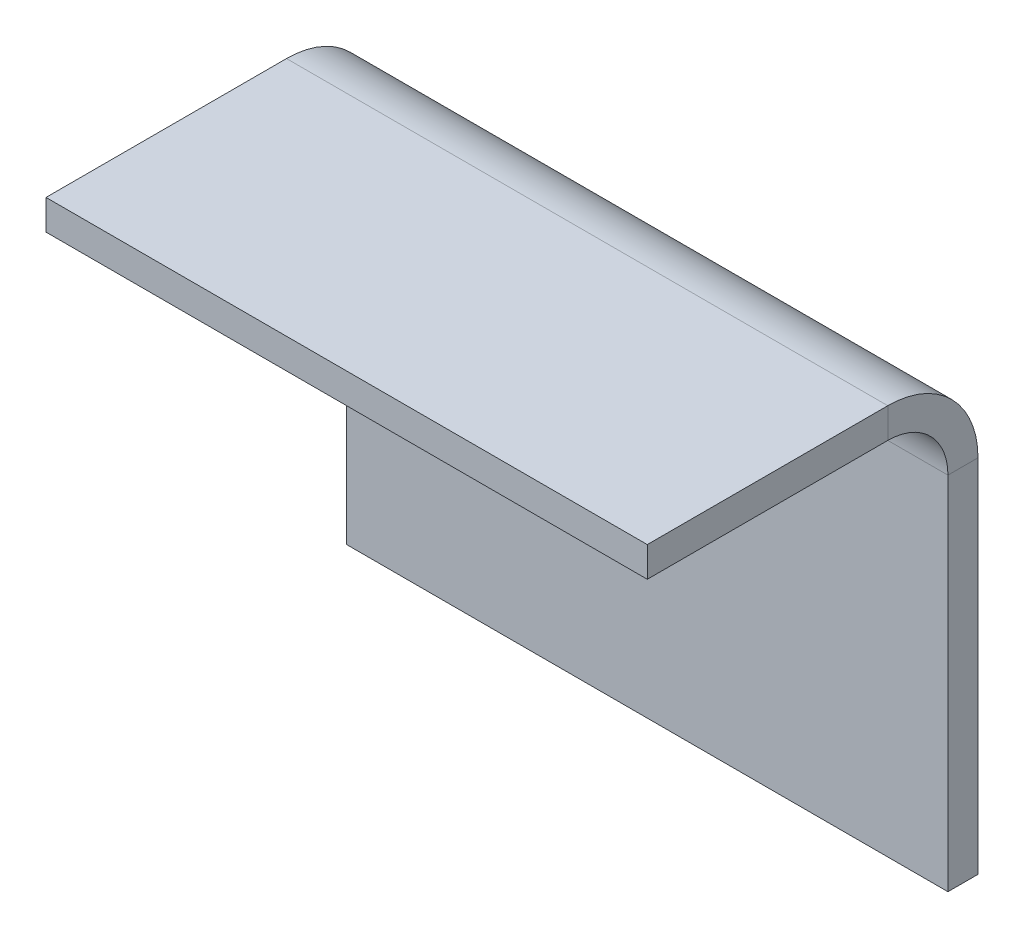
ISO-10303-21;
HEADER;
FILE_DESCRIPTION(('STEP AP214'),'2;1');
FILE_NAME('part.step','',(''),(''),'','','');
FILE_SCHEMA(('AUTOMOTIVE_DESIGN { 1 0 10303 214 1 1 1 1 }'));
ENDSEC;
DATA;
#1=APPLICATION_CONTEXT('core data for automotive mechanical design processes');
#2=APPLICATION_PROTOCOL_DEFINITION('international standard','automotive_design',2000,#1);
#3=PRODUCT_CONTEXT('',#1,'mechanical');
#4=PRODUCT('Part','Part','',(#3));
#5=PRODUCT_RELATED_PRODUCT_CATEGORY('part','',(#4));
#6=PRODUCT_DEFINITION_FORMATION('','',#4);
#7=PRODUCT_DEFINITION_CONTEXT('part definition',#1,'design');
#8=PRODUCT_DEFINITION('design','',#6,#7);
#9=PRODUCT_DEFINITION_SHAPE('','',#8);
#10=(LENGTH_UNIT() NAMED_UNIT(*) SI_UNIT(.MILLI.,.METRE.));
#11=(NAMED_UNIT(*) PLANE_ANGLE_UNIT() SI_UNIT($,.RADIAN.));
#12=(NAMED_UNIT(*) SI_UNIT($,.STERADIAN.) SOLID_ANGLE_UNIT());
#13=UNCERTAINTY_MEASURE_WITH_UNIT(LENGTH_MEASURE(1.E-05),#10,'distance_accuracy_value','');
#14=(GEOMETRIC_REPRESENTATION_CONTEXT(3) GLOBAL_UNCERTAINTY_ASSIGNED_CONTEXT((#13)) GLOBAL_UNIT_ASSIGNED_CONTEXT((#10,
#11,#12)) REPRESENTATION_CONTEXT('',''));
#15=CARTESIAN_POINT('',(0.,0.,0.));
#16=DIRECTION('',(0.,0.,1.));
#17=DIRECTION('',(1.,0.,0.));
#18=AXIS2_PLACEMENT_3D('',#15,#16,#17);
#19=CARTESIAN_POINT('',(0.,0.,-1.));
#20=DIRECTION('',(-1.,0.,0.));
#21=DIRECTION('',(0.,0.,1.));
#22=AXIS2_PLACEMENT_3D('',#19,#20,#21);
#23=PLANE('',#22);
#24=DIRECTION('',(0.,-1.,0.));
#25=VECTOR('',#24,1.);
#26=CARTESIAN_POINT('',(0.,0.,0.));
#27=LINE('',#26,#25);
#28=CARTESIAN_POINT('',(0.,12.,0.));
#29=VERTEX_POINT('',#28);
#30=CARTESIAN_POINT('',(0.,0.,0.));
#31=VERTEX_POINT('',#30);
#32=EDGE_CURVE('E192',#29,#31,#27,.T.);
#33=ORIENTED_EDGE('',*,*,#32,.F.);
#34=DIRECTION('',(0.,0.,-1.));
#35=VECTOR('',#34,1.);
#36=CARTESIAN_POINT('',(0.,12.,0.));
#37=LINE('',#36,#35);
#38=CARTESIAN_POINT('',(0.,12.,-1.));
#39=VERTEX_POINT('',#38);
#40=EDGE_CURVE('E180',#29,#39,#37,.T.);
#41=ORIENTED_EDGE('',*,*,#40,.T.);
#42=DIRECTION('',(0.,-1.,0.));
#43=VECTOR('',#42,1.);
#44=CARTESIAN_POINT('',(0.,0.,-1.));
#45=LINE('',#44,#43);
#46=CARTESIAN_POINT('',(0.,0.,-1.));
#47=VERTEX_POINT('',#46);
#48=EDGE_CURVE('E191',#39,#47,#45,.T.);
#49=ORIENTED_EDGE('',*,*,#48,.T.);
#50=DIRECTION('',(0.,0.,1.));
#51=VECTOR('',#50,1.);
#52=CARTESIAN_POINT('',(0.,0.,-1.));
#53=LINE('',#52,#51);
#54=EDGE_CURVE('E70',#47,#31,#53,.T.);
#55=ORIENTED_EDGE('',*,*,#54,.T.);
#56=EDGE_LOOP('',(#33,#41,#49,#55));
#57=FACE_BOUND('',#56,.T.);
#58=ADVANCED_FACE('F61',(#57),#23,.T.);
#59=CARTESIAN_POINT('',(20.,0.,-1.));
#60=DIRECTION('',(1.,0.,0.));
#61=DIRECTION('',(0.,0.,-1.));
#62=AXIS2_PLACEMENT_3D('',#59,#60,#61);
#63=PLANE('',#62);
#64=DIRECTION('',(0.,1.,0.));
#65=VECTOR('',#64,1.);
#66=CARTESIAN_POINT('',(20.,0.,0.));
#67=LINE('',#66,#65);
#68=CARTESIAN_POINT('',(20.,0.,0.));
#69=VERTEX_POINT('',#68);
#70=CARTESIAN_POINT('',(20.,12.,0.));
#71=VERTEX_POINT('',#70);
#72=EDGE_CURVE('E197',#69,#71,#67,.T.);
#73=ORIENTED_EDGE('',*,*,#72,.F.);
#74=DIRECTION('',(0.,0.,1.));
#75=VECTOR('',#74,1.);
#76=CARTESIAN_POINT('',(20.,0.,-1.));
#77=LINE('',#76,#75);
#78=CARTESIAN_POINT('',(20.,0.,-1.));
#79=VERTEX_POINT('',#78);
#80=EDGE_CURVE('E13',#79,#69,#77,.T.);
#81=ORIENTED_EDGE('',*,*,#80,.F.);
#82=DIRECTION('',(0.,1.,0.));
#83=VECTOR('',#82,1.);
#84=CARTESIAN_POINT('',(20.,0.,-1.));
#85=LINE('',#84,#83);
#86=CARTESIAN_POINT('',(20.,12.,-1.));
#87=VERTEX_POINT('',#86);
#88=EDGE_CURVE('E199',#79,#87,#85,.T.);
#89=ORIENTED_EDGE('',*,*,#88,.T.);
#90=DIRECTION('',(0.,0.,-1.));
#91=VECTOR('',#90,1.);
#92=CARTESIAN_POINT('',(20.,12.,0.));
#93=LINE('',#92,#91);
#94=EDGE_CURVE('E190',#71,#87,#93,.T.);
#95=ORIENTED_EDGE('',*,*,#94,.F.);
#96=EDGE_LOOP('',(#73,#81,#89,#95));
#97=FACE_BOUND('',#96,.T.);
#98=ADVANCED_FACE('F215',(#97),#63,.T.);
#99=CARTESIAN_POINT('',(0.,0.,-1.));
#100=DIRECTION('',(0.,-1.,0.));
#101=DIRECTION('',(0.,0.,-1.));
#102=AXIS2_PLACEMENT_3D('',#99,#100,#101);
#103=PLANE('',#102);
#104=DIRECTION('',(1.,0.,0.));
#105=VECTOR('',#104,1.);
#106=CARTESIAN_POINT('',(0.,0.,0.));
#107=LINE('',#106,#105);
#108=EDGE_CURVE('E204',#31,#69,#107,.T.);
#109=ORIENTED_EDGE('',*,*,#108,.F.);
#110=ORIENTED_EDGE('',*,*,#54,.F.);
#111=DIRECTION('',(1.,0.,0.));
#112=VECTOR('',#111,1.);
#113=CARTESIAN_POINT('',(0.,0.,-1.));
#114=LINE('',#113,#112);
#115=EDGE_CURVE('E198',#47,#79,#114,.T.);
#116=ORIENTED_EDGE('',*,*,#115,.T.);
#117=ORIENTED_EDGE('',*,*,#80,.T.);
#118=EDGE_LOOP('',(#109,#110,#116,#117));
#119=FACE_BOUND('',#118,.T.);
#120=ADVANCED_FACE('F236',(#119),#103,.T.);
#121=CARTESIAN_POINT('',(0.,0.,-1.));
#122=DIRECTION('',(0.,0.,-1.));
#123=DIRECTION('',(-1.,0.,0.));
#124=AXIS2_PLACEMENT_3D('',#121,#122,#123);
#125=PLANE('',#124);
#126=ORIENTED_EDGE('',*,*,#48,.F.);
#127=DIRECTION('',(-1.,0.,0.));
#128=VECTOR('',#127,1.);
#129=CARTESIAN_POINT('',(0.,12.,-1.));
#130=LINE('',#129,#128);
#131=EDGE_CURVE('E172',#39,#87,#130,.F.);
#132=ORIENTED_EDGE('',*,*,#131,.T.);
#133=ORIENTED_EDGE('',*,*,#88,.F.);
#134=ORIENTED_EDGE('',*,*,#115,.F.);
#135=EDGE_LOOP('',(#126,#132,#133,#134));
#136=FACE_BOUND('',#135,.T.);
#137=ADVANCED_FACE('F232',(#136),#125,.T.);
#138=CARTESIAN_POINT('',(0.,0.,0.));
#139=DIRECTION('',(0.,0.,-1.));
#140=DIRECTION('',(-1.,0.,0.));
#141=AXIS2_PLACEMENT_3D('',#138,#139,#140);
#142=PLANE('',#141);
#143=ORIENTED_EDGE('',*,*,#32,.T.);
#144=ORIENTED_EDGE('',*,*,#108,.T.);
#145=ORIENTED_EDGE('',*,*,#72,.T.);
#146=DIRECTION('',(-1.,0.,0.));
#147=VECTOR('',#146,1.);
#148=CARTESIAN_POINT('',(0.,12.,0.));
#149=LINE('',#148,#147);
#150=EDGE_CURVE('E184',#29,#71,#149,.F.);
#151=ORIENTED_EDGE('',*,*,#150,.F.);
#152=EDGE_LOOP('',(#143,#144,#145,#151));
#153=FACE_BOUND('',#152,.T.);
#154=ADVANCED_FACE('F211',(#153),#142,.F.);
#155=CARTESIAN_POINT('',(20.,12.,2.));
#156=DIRECTION('',(1.,0.,0.));
#157=DIRECTION('',(0.,0.,-1.));
#158=AXIS2_PLACEMENT_3D('',#155,#156,#157);
#159=PLANE('',#158);
#160=DIRECTION('',(0.,-1.,0.));
#161=VECTOR('',#160,1.);
#162=CARTESIAN_POINT('',(20.,15.,2.));
#163=LINE('',#162,#161);
#164=CARTESIAN_POINT('',(20.,14.,2.));
#165=VERTEX_POINT('',#164);
#166=CARTESIAN_POINT('',(20.,15.,2.));
#167=VERTEX_POINT('',#166);
#168=EDGE_CURVE('E156',#165,#167,#163,.F.);
#169=ORIENTED_EDGE('',*,*,#168,.F.);
#170=CARTESIAN_POINT('',(20.,12.,2.));
#171=DIRECTION('',(-1.,0.,0.));
#172=DIRECTION('',(0.,0.,1.));
#173=AXIS2_PLACEMENT_3D('',#170,#171,#172);
#174=CIRCLE('',#173,2.);
#175=EDGE_CURVE('E182',#71,#165,#174,.F.);
#176=ORIENTED_EDGE('',*,*,#175,.F.);
#177=ORIENTED_EDGE('',*,*,#94,.T.);
#178=CARTESIAN_POINT('',(20.,12.,2.));
#179=DIRECTION('',(-1.,0.,0.));
#180=DIRECTION('',(0.,0.,1.));
#181=AXIS2_PLACEMENT_3D('',#178,#179,#180);
#182=CIRCLE('',#181,3.);
#183=EDGE_CURVE('E100',#87,#167,#182,.F.);
#184=ORIENTED_EDGE('',*,*,#183,.T.);
#185=EDGE_LOOP('',(#169,#176,#177,#184));
#186=FACE_BOUND('',#185,.T.);
#187=ADVANCED_FACE('F214',(#186),#159,.T.);
#188=CARTESIAN_POINT('',(0.,12.,2.));
#189=DIRECTION('',(1.,0.,0.));
#190=DIRECTION('',(0.,0.,-1.));
#191=AXIS2_PLACEMENT_3D('',#188,#189,#190);
#192=PLANE('',#191);
#193=CARTESIAN_POINT('',(0.,12.,2.));
#194=DIRECTION('',(-1.,0.,0.));
#195=DIRECTION('',(0.,0.,1.));
#196=AXIS2_PLACEMENT_3D('',#193,#194,#195);
#197=CIRCLE('',#196,2.);
#198=CARTESIAN_POINT('',(0.,14.,2.));
#199=VERTEX_POINT('',#198);
#200=EDGE_CURVE('E188',#199,#29,#197,.T.);
#201=ORIENTED_EDGE('',*,*,#200,.F.);
#202=DIRECTION('',(0.,-1.,0.));
#203=VECTOR('',#202,1.);
#204=CARTESIAN_POINT('',(0.,14.,2.));
#205=LINE('',#204,#203);
#206=CARTESIAN_POINT('',(0.,15.,2.));
#207=VERTEX_POINT('',#206);
#208=EDGE_CURVE('E170',#199,#207,#205,.F.);
#209=ORIENTED_EDGE('',*,*,#208,.T.);
#210=CARTESIAN_POINT('',(0.,12.,2.));
#211=DIRECTION('',(-1.,0.,0.));
#212=DIRECTION('',(0.,0.,1.));
#213=AXIS2_PLACEMENT_3D('',#210,#211,#212);
#214=CIRCLE('',#213,3.);
#215=EDGE_CURVE('E177',#207,#39,#214,.T.);
#216=ORIENTED_EDGE('',*,*,#215,.T.);
#217=ORIENTED_EDGE('',*,*,#40,.F.);
#218=EDGE_LOOP('',(#201,#209,#216,#217));
#219=FACE_BOUND('',#218,.T.);
#220=ADVANCED_FACE('F229',(#219),#192,.F.);
#221=CARTESIAN_POINT('',(0.,12.,2.));
#222=DIRECTION('',(-1.,0.,0.));
#223=DIRECTION('',(0.,1.,0.));
#224=AXIS2_PLACEMENT_3D('',#221,#222,#223);
#225=CYLINDRICAL_SURFACE('',#224,3.);
#226=ORIENTED_EDGE('',*,*,#131,.F.);
#227=ORIENTED_EDGE('',*,*,#215,.F.);
#228=DIRECTION('',(-1.,0.,0.));
#229=VECTOR('',#228,1.);
#230=CARTESIAN_POINT('',(20.,15.,2.));
#231=LINE('',#230,#229);
#232=EDGE_CURVE('E164',#207,#167,#231,.F.);
#233=ORIENTED_EDGE('',*,*,#232,.T.);
#234=ORIENTED_EDGE('',*,*,#183,.F.);
#235=EDGE_LOOP('',(#226,#227,#233,#234));
#236=FACE_BOUND('',#235,.T.);
#237=ADVANCED_FACE('F230',(#236),#225,.T.);
#238=CARTESIAN_POINT('',(0.,12.,2.));
#239=DIRECTION('',(-1.,0.,0.));
#240=DIRECTION('',(0.,1.,0.));
#241=AXIS2_PLACEMENT_3D('',#238,#239,#240);
#242=CYLINDRICAL_SURFACE('',#241,2.);
#243=ORIENTED_EDGE('',*,*,#150,.T.);
#244=ORIENTED_EDGE('',*,*,#175,.T.);
#245=DIRECTION('',(-1.,0.,0.));
#246=VECTOR('',#245,1.);
#247=CARTESIAN_POINT('',(20.,14.,2.));
#248=LINE('',#247,#246);
#249=EDGE_CURVE('E168',#165,#199,#248,.T.);
#250=ORIENTED_EDGE('',*,*,#249,.T.);
#251=ORIENTED_EDGE('',*,*,#200,.T.);
#252=EDGE_LOOP('',(#243,#244,#250,#251));
#253=FACE_BOUND('',#252,.T.);
#254=ADVANCED_FACE('F217',(#253),#242,.F.);
#255=CARTESIAN_POINT('',(20.,15.,0.));
#256=DIRECTION('',(-1.,0.,0.));
#257=DIRECTION('',(0.,0.,1.));
#258=AXIS2_PLACEMENT_3D('',#255,#256,#257);
#259=PLANE('',#258);
#260=ORIENTED_EDGE('',*,*,#168,.T.);
#261=DIRECTION('',(0.,0.,-1.));
#262=VECTOR('',#261,1.);
#263=CARTESIAN_POINT('',(20.,15.,0.));
#264=LINE('',#263,#262);
#265=CARTESIAN_POINT('',(20.,15.,10.));
#266=VERTEX_POINT('',#265);
#267=EDGE_CURVE('E139',#266,#167,#264,.T.);
#268=ORIENTED_EDGE('',*,*,#267,.F.);
#269=DIRECTION('',(0.,-1.,0.));
#270=VECTOR('',#269,1.);
#271=CARTESIAN_POINT('',(20.,15.,10.));
#272=LINE('',#271,#270);
#273=CARTESIAN_POINT('',(20.,14.,10.));
#274=VERTEX_POINT('',#273);
#275=EDGE_CURVE('E141',#266,#274,#272,.T.);
#276=ORIENTED_EDGE('',*,*,#275,.T.);
#277=DIRECTION('',(0.,0.,1.));
#278=VECTOR('',#277,1.);
#279=CARTESIAN_POINT('',(20.,14.,0.));
#280=LINE('',#279,#278);
#281=EDGE_CURVE('E162',#274,#165,#280,.F.);
#282=ORIENTED_EDGE('',*,*,#281,.T.);
#283=EDGE_LOOP('',(#260,#268,#276,#282));
#284=FACE_BOUND('',#283,.T.);
#285=ADVANCED_FACE('F154',(#284),#259,.F.);
#286=CARTESIAN_POINT('',(0.,15.,0.));
#287=DIRECTION('',(1.,0.,0.));
#288=DIRECTION('',(0.,0.,-1.));
#289=AXIS2_PLACEMENT_3D('',#286,#287,#288);
#290=PLANE('',#289);
#291=ORIENTED_EDGE('',*,*,#208,.F.);
#292=DIRECTION('',(0.,0.,-1.));
#293=VECTOR('',#292,1.);
#294=CARTESIAN_POINT('',(0.,14.,0.));
#295=LINE('',#294,#293);
#296=CARTESIAN_POINT('',(0.,14.,10.));
#297=VERTEX_POINT('',#296);
#298=EDGE_CURVE('E157',#199,#297,#295,.F.);
#299=ORIENTED_EDGE('',*,*,#298,.T.);
#300=DIRECTION('',(0.,-1.,0.));
#301=VECTOR('',#300,1.);
#302=CARTESIAN_POINT('',(0.,15.,10.));
#303=LINE('',#302,#301);
#304=CARTESIAN_POINT('',(0.,15.,10.));
#305=VERTEX_POINT('',#304);
#306=EDGE_CURVE('E155',#305,#297,#303,.T.);
#307=ORIENTED_EDGE('',*,*,#306,.F.);
#308=DIRECTION('',(0.,0.,1.));
#309=VECTOR('',#308,1.);
#310=CARTESIAN_POINT('',(0.,15.,0.));
#311=LINE('',#310,#309);
#312=EDGE_CURVE('E136',#207,#305,#311,.T.);
#313=ORIENTED_EDGE('',*,*,#312,.F.);
#314=EDGE_LOOP('',(#291,#299,#307,#313));
#315=FACE_BOUND('',#314,.T.);
#316=ADVANCED_FACE('F223',(#315),#290,.F.);
#317=CARTESIAN_POINT('',(0.,15.,0.));
#318=DIRECTION('',(0.,-1.,0.));
#319=DIRECTION('',(0.,0.,-1.));
#320=AXIS2_PLACEMENT_3D('',#317,#318,#319);
#321=PLANE('',#320);
#322=ORIENTED_EDGE('',*,*,#232,.F.);
#323=ORIENTED_EDGE('',*,*,#312,.T.);
#324=DIRECTION('',(1.,0.,0.));
#325=VECTOR('',#324,1.);
#326=CARTESIAN_POINT('',(0.,15.,10.));
#327=LINE('',#326,#325);
#328=EDGE_CURVE('E134',#305,#266,#327,.T.);
#329=ORIENTED_EDGE('',*,*,#328,.T.);
#330=ORIENTED_EDGE('',*,*,#267,.T.);
#331=EDGE_LOOP('',(#322,#323,#329,#330));
#332=FACE_BOUND('',#331,.T.);
#333=ADVANCED_FACE('F131',(#332),#321,.F.);
#334=CARTESIAN_POINT('',(0.,14.,0.));
#335=DIRECTION('',(0.,-1.,0.));
#336=DIRECTION('',(0.,0.,-1.));
#337=AXIS2_PLACEMENT_3D('',#334,#335,#336);
#338=PLANE('',#337);
#339=ORIENTED_EDGE('',*,*,#298,.F.);
#340=ORIENTED_EDGE('',*,*,#249,.F.);
#341=ORIENTED_EDGE('',*,*,#281,.F.);
#342=DIRECTION('',(-1.,0.,0.));
#343=VECTOR('',#342,1.);
#344=CARTESIAN_POINT('',(20.,14.,10.));
#345=LINE('',#344,#343);
#346=EDGE_CURVE('E146',#297,#274,#345,.F.);
#347=ORIENTED_EDGE('',*,*,#346,.F.);
#348=EDGE_LOOP('',(#339,#340,#341,#347));
#349=FACE_BOUND('',#348,.T.);
#350=ADVANCED_FACE('F225',(#349),#338,.T.);
#351=CARTESIAN_POINT('',(20.,15.,10.));
#352=DIRECTION('',(0.,0.,-1.));
#353=DIRECTION('',(0.,1.,0.));
#354=AXIS2_PLACEMENT_3D('',#351,#352,#353);
#355=PLANE('',#354);
#356=ORIENTED_EDGE('',*,*,#346,.T.);
#357=ORIENTED_EDGE('',*,*,#275,.F.);
#358=ORIENTED_EDGE('',*,*,#328,.F.);
#359=ORIENTED_EDGE('',*,*,#306,.T.);
#360=EDGE_LOOP('',(#356,#357,#358,#359));
#361=FACE_BOUND('',#360,.T.);
#362=ADVANCED_FACE('F148',(#361),#355,.F.);
#363=CLOSED_SHELL('',(#58,#98,#120,#137,#154,#187,#220,#237,#254,#285,#316,#333,#350,#362));
#364=MANIFOLD_SOLID_BREP('B2',#363);
#365=ADVANCED_BREP_SHAPE_REPRESENTATION('',(#18,#364),#14);
#366=SHAPE_DEFINITION_REPRESENTATION(#9,#365);
ENDSEC;
END-ISO-10303-21;
